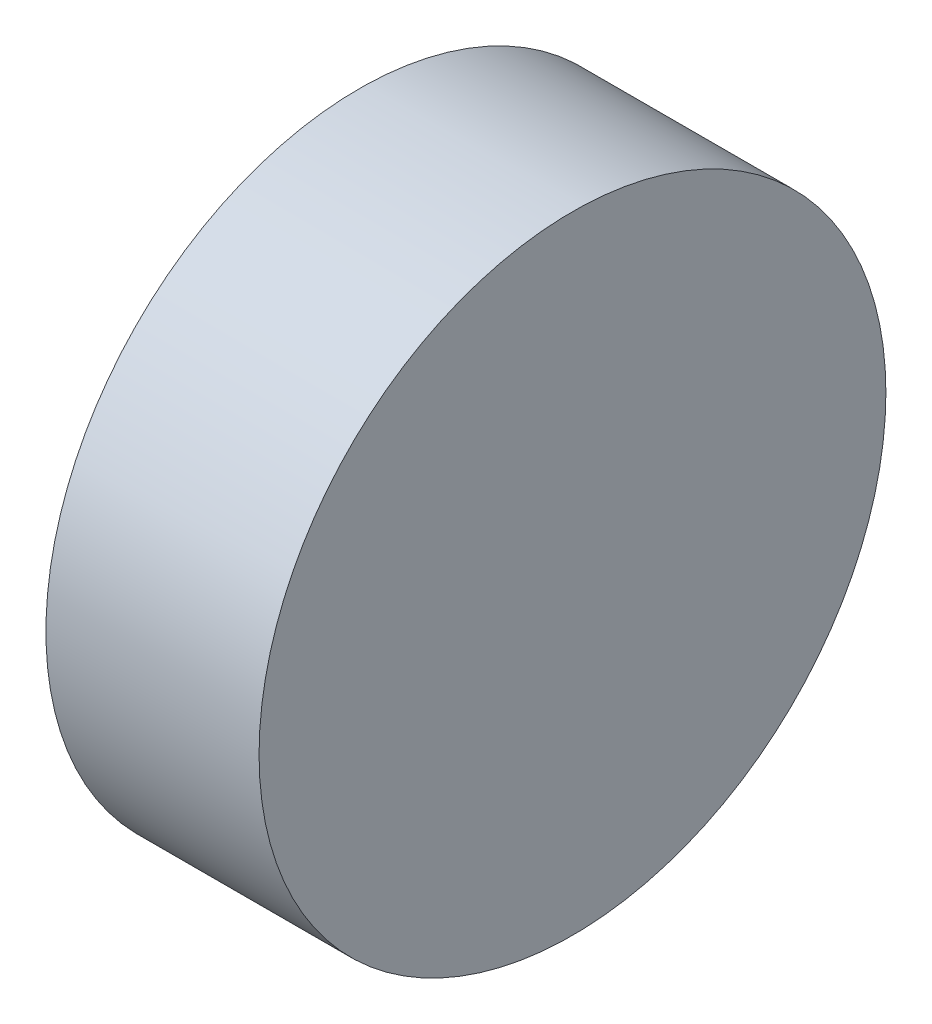
ISO-10303-21;
HEADER;
FILE_DESCRIPTION(('STEP AP214'),'2;1');
FILE_NAME('part.step','',(''),(''),'','','');
FILE_SCHEMA(('AUTOMOTIVE_DESIGN { 1 0 10303 214 1 1 1 1 }'));
ENDSEC;
DATA;
#1=APPLICATION_CONTEXT('core data for automotive mechanical design processes');
#2=APPLICATION_PROTOCOL_DEFINITION('international standard','automotive_design',2000,#1);
#3=PRODUCT_CONTEXT('',#1,'mechanical');
#4=PRODUCT('Part','Part','',(#3));
#5=PRODUCT_RELATED_PRODUCT_CATEGORY('part','',(#4));
#6=PRODUCT_DEFINITION_FORMATION('','',#4);
#7=PRODUCT_DEFINITION_CONTEXT('part definition',#1,'design');
#8=PRODUCT_DEFINITION('design','',#6,#7);
#9=PRODUCT_DEFINITION_SHAPE('','',#8);
#10=(LENGTH_UNIT() NAMED_UNIT(*) SI_UNIT(.MILLI.,.METRE.));
#11=(NAMED_UNIT(*) PLANE_ANGLE_UNIT() SI_UNIT($,.RADIAN.));
#12=(NAMED_UNIT(*) SI_UNIT($,.STERADIAN.) SOLID_ANGLE_UNIT());
#13=UNCERTAINTY_MEASURE_WITH_UNIT(LENGTH_MEASURE(1.E-05),#10,'distance_accuracy_value','');
#14=(GEOMETRIC_REPRESENTATION_CONTEXT(3) GLOBAL_UNCERTAINTY_ASSIGNED_CONTEXT((#13)) GLOBAL_UNIT_ASSIGNED_CONTEXT((#10,
#11,#12)) REPRESENTATION_CONTEXT('',''));
#15=CARTESIAN_POINT('',(0.,0.,0.));
#16=DIRECTION('',(0.,0.,1.));
#17=DIRECTION('',(1.,0.,0.));
#18=AXIS2_PLACEMENT_3D('',#15,#16,#17);
#19=CARTESIAN_POINT('',(1.7,0.,0.));
#20=DIRECTION('',(1.,0.,0.));
#21=DIRECTION('',(0.,0.,-1.));
#22=AXIS2_PLACEMENT_3D('',#19,#20,#21);
#23=PLANE('',#22);
#24=CARTESIAN_POINT('',(1.7,0.,0.));
#25=DIRECTION('',(-1.,0.,0.));
#26=DIRECTION('',(0.,0.,1.));
#27=AXIS2_PLACEMENT_3D('',#24,#25,#26);
#28=CIRCLE('',#27,5.);
#29=CARTESIAN_POINT('',(1.7,0.,5.));
#30=VERTEX_POINT('',#29);
#31=EDGE_CURVE('E9',#30,#30,#28,.T.);
#32=ORIENTED_EDGE('',*,*,#31,.F.);
#33=EDGE_LOOP('',(#32));
#34=FACE_BOUND('',#33,.T.);
#35=ADVANCED_FACE('F14',(#34),#23,.T.);
#36=CARTESIAN_POINT('',(-1.7,0.,0.));
#37=DIRECTION('',(-1.,0.,0.));
#38=DIRECTION('',(0.,0.,1.));
#39=AXIS2_PLACEMENT_3D('',#36,#37,#38);
#40=PLANE('',#39);
#41=CARTESIAN_POINT('',(-1.7,0.,0.));
#42=DIRECTION('',(1.,0.,0.));
#43=DIRECTION('',(0.,0.,-1.));
#44=AXIS2_PLACEMENT_3D('',#41,#42,#43);
#45=CIRCLE('',#44,5.);
#46=CARTESIAN_POINT('',(-1.7,0.,-5.));
#47=VERTEX_POINT('',#46);
#48=EDGE_CURVE('E21',#47,#47,#45,.T.);
#49=ORIENTED_EDGE('',*,*,#48,.F.);
#50=EDGE_LOOP('',(#49));
#51=FACE_BOUND('',#50,.T.);
#52=ADVANCED_FACE('F28',(#51),#40,.T.);
#53=CARTESIAN_POINT('',(-1.7,0.,0.));
#54=DIRECTION('',(1.,0.,0.));
#55=DIRECTION('',(0.,0.,-1.));
#56=AXIS2_PLACEMENT_3D('',#53,#54,#55);
#57=CYLINDRICAL_SURFACE('',#56,5.);
#58=ORIENTED_EDGE('',*,*,#31,.T.);
#59=EDGE_LOOP('',(#58));
#60=FACE_BOUND('',#59,.T.);
#61=ORIENTED_EDGE('',*,*,#48,.T.);
#62=EDGE_LOOP('',(#61));
#63=FACE_BOUND('',#62,.T.);
#64=ADVANCED_FACE('F16',(#60,#63),#57,.T.);
#65=CLOSED_SHELL('',(#35,#52,#64));
#66=MANIFOLD_SOLID_BREP('B1',#65);
#67=ADVANCED_BREP_SHAPE_REPRESENTATION('',(#18,#66),#14);
#68=SHAPE_DEFINITION_REPRESENTATION(#9,#67);
ENDSEC;
END-ISO-10303-21;
